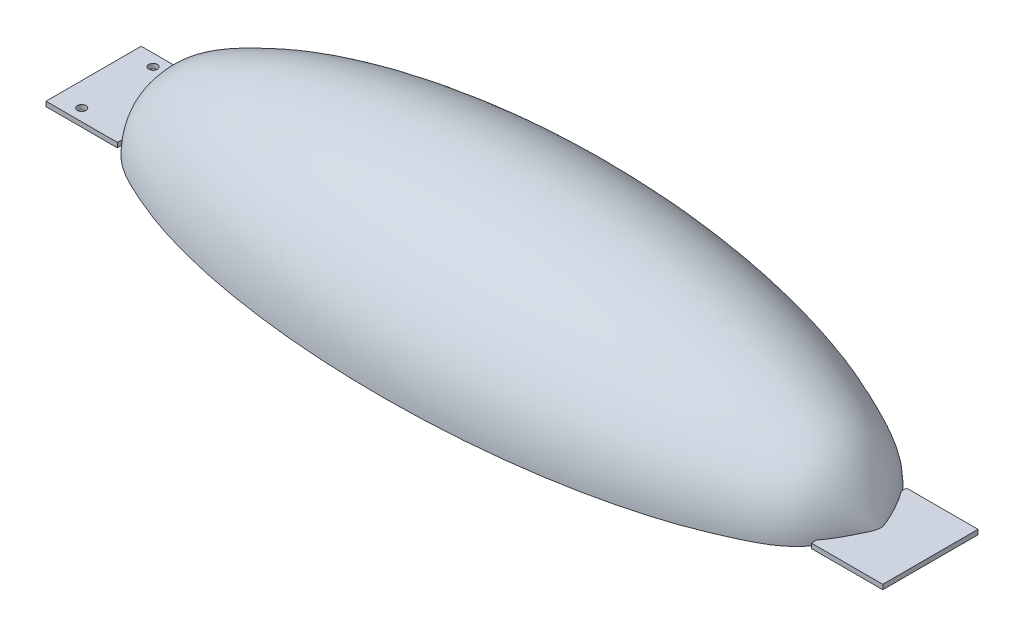
ISO-10303-21;
HEADER;
FILE_DESCRIPTION(('STEP AP214'),'2;1');
FILE_NAME('part.step','',(''),(''),'','','');
FILE_SCHEMA(('AUTOMOTIVE_DESIGN { 1 0 10303 214 1 1 1 1 }'));
ENDSEC;
DATA;
#1=APPLICATION_CONTEXT('core data for automotive mechanical design processes');
#2=APPLICATION_PROTOCOL_DEFINITION('international standard','automotive_design',2000,#1);
#3=PRODUCT_CONTEXT('',#1,'mechanical');
#4=PRODUCT('Part','Part','',(#3));
#5=PRODUCT_RELATED_PRODUCT_CATEGORY('part','',(#4));
#6=PRODUCT_DEFINITION_FORMATION('','',#4);
#7=PRODUCT_DEFINITION_CONTEXT('part definition',#1,'design');
#8=PRODUCT_DEFINITION('design','',#6,#7);
#9=PRODUCT_DEFINITION_SHAPE('','',#8);
#10=(LENGTH_UNIT() NAMED_UNIT(*) SI_UNIT(.MILLI.,.METRE.));
#11=(NAMED_UNIT(*) PLANE_ANGLE_UNIT() SI_UNIT($,.RADIAN.));
#12=(NAMED_UNIT(*) SI_UNIT($,.STERADIAN.) SOLID_ANGLE_UNIT());
#13=UNCERTAINTY_MEASURE_WITH_UNIT(LENGTH_MEASURE(1.E-05),#10,'distance_accuracy_value','');
#14=(GEOMETRIC_REPRESENTATION_CONTEXT(3) GLOBAL_UNCERTAINTY_ASSIGNED_CONTEXT((#13)) GLOBAL_UNIT_ASSIGNED_CONTEXT((#10,
#11,#12)) REPRESENTATION_CONTEXT('',''));
#15=CARTESIAN_POINT('',(0.,0.,0.));
#16=DIRECTION('',(0.,0.,1.));
#17=DIRECTION('',(1.,0.,0.));
#18=AXIS2_PLACEMENT_3D('',#15,#16,#17);
#19=CARTESIAN_POINT('',(0.,0.,0.));
#20=CARTESIAN_POINT('',(-4.24918863823681,8.93994620161365,0.));
#21=CARTESIAN_POINT('',(-11.1739289632086,23.5090348526368,0.));
#22=CARTESIAN_POINT('',(-30.8101621592941,33.0469746867475,0.));
#23=CARTESIAN_POINT('',(-46.4415498782957,39.4769067402592,0.));
#24=CARTESIAN_POINT('',(-62.1775393076959,44.1339298862083,0.));
#25=CARTESIAN_POINT('',(-77.7885811071484,47.7570774206576,0.));
#26=CARTESIAN_POINT('',(-93.3968557858967,50.5181034476359,0.));
#27=CARTESIAN_POINT('',(-108.989945516036,52.5682722732172,0.));
#28=CARTESIAN_POINT('',(-124.579052843171,53.9844773462628,0.));
#29=CARTESIAN_POINT('',(-140.165074085182,54.8168656468974,0.));
#30=CARTESIAN_POINT('',(-155.75,55.0915085626568,0.));
#31=CARTESIAN_POINT('',(-171.334925914818,54.8168656468974,0.));
#32=CARTESIAN_POINT('',(-186.920947156829,53.9844773462628,0.));
#33=CARTESIAN_POINT('',(-202.510054483964,52.5682722732172,0.));
#34=CARTESIAN_POINT('',(-218.103144214103,50.5181034476359,0.));
#35=CARTESIAN_POINT('',(-233.711418892852,47.7570774206576,0.));
#36=CARTESIAN_POINT('',(-249.322460692304,44.1339298862083,0.));
#37=CARTESIAN_POINT('',(-265.058450121704,39.4769067402592,0.));
#38=CARTESIAN_POINT('',(-280.689837840706,33.0469746867476,0.));
#39=CARTESIAN_POINT('',(-300.326071036791,23.5090348526368,0.));
#40=CARTESIAN_POINT('',(-307.250811361763,8.93994620161365,0.));
#41=CARTESIAN_POINT('',(-311.5,0.,0.));
#42=B_SPLINE_CURVE_WITH_KNOTS('',3,(#19,#20,#21,#22,#23,#24,#25,#26,#27,#28,#29,#30,#31,#32,#33,
#34,#35,#36,#37,#38,#39,#40,#41),.UNSPECIFIED.,.F.,.F.,(4,1,1,1,1,1,1,1,1,1,1,1,1,1,1,1,1,1,1,1,
4),(0.,0.0821539230820725,0.133883108624973,0.182138728200726,0.228907224084584,
0.274864284857434,0.32032674165642,0.365472529622241,0.410415352889982,0.455236348864807,0.5,
0.544763651135193,0.589584647110018,0.634527470377759,0.67967325834358,0.725135715142566,
0.771092775915416,0.817861271799274,0.866116891375027,0.917846076917928,1.),.UNSPECIFIED.);
#43=CARTESIAN_POINT('',(10.,0.,0.));
#44=DIRECTION('',(1.,0.,0.));
#45=AXIS1_PLACEMENT('',#43,#44);
#46=SURFACE_OF_REVOLUTION('',#42,#45);
#47=CARTESIAN_POINT('',(0.,0.,0.));
#48=CARTESIAN_POINT('',(-4.24918863823681,0.,-8.93994620161365));
#49=CARTESIAN_POINT('',(-11.1739289632086,0.,-23.5090348526368));
#50=CARTESIAN_POINT('',(-30.8101621592941,0.,-33.0469746867475));
#51=CARTESIAN_POINT('',(-46.4415498782957,0.,-39.4769067402592));
#52=CARTESIAN_POINT('',(-62.1775393076959,0.,-44.1339298862083));
#53=CARTESIAN_POINT('',(-77.7885811071484,0.,-47.7570774206576));
#54=CARTESIAN_POINT('',(-93.3968557858967,0.,-50.5181034476359));
#55=CARTESIAN_POINT('',(-108.989945516036,0.,-52.5682722732172));
#56=CARTESIAN_POINT('',(-124.579052843171,0.,-53.9844773462628));
#57=CARTESIAN_POINT('',(-140.165074085182,0.,-54.8168656468974));
#58=CARTESIAN_POINT('',(-155.75,0.,-55.0915085626568));
#59=CARTESIAN_POINT('',(-171.334925914818,0.,-54.8168656468974));
#60=CARTESIAN_POINT('',(-186.920947156829,0.,-53.9844773462628));
#61=CARTESIAN_POINT('',(-202.510054483964,0.,-52.5682722732172));
#62=CARTESIAN_POINT('',(-218.103144214103,0.,-50.5181034476359));
#63=CARTESIAN_POINT('',(-233.711418892852,0.,-47.7570774206576));
#64=CARTESIAN_POINT('',(-249.322460692304,0.,-44.1339298862083));
#65=CARTESIAN_POINT('',(-265.058450121704,0.,-39.4769067402592));
#66=CARTESIAN_POINT('',(-280.689837840706,0.,-33.0469746867476));
#67=CARTESIAN_POINT('',(-300.326071036791,0.,-23.5090348526368));
#68=CARTESIAN_POINT('',(-307.250811361763,0.,-8.93994620161365));
#69=CARTESIAN_POINT('',(-311.5,0.,0.));
#70=B_SPLINE_CURVE_WITH_KNOTS('',3,(#47,#48,#49,#50,#51,#52,#53,#54,#55,#56,#57,#58,#59,#60,#61,
#62,#63,#64,#65,#66,#67,#68,#69),.UNSPECIFIED.,.F.,.F.,(4,1,1,1,1,1,1,1,1,1,1,1,1,1,1,1,1,1,1,1,
4),(0.,0.0821539230820725,0.133883108624973,0.182138728200726,0.228907224084584,
0.274864284857434,0.32032674165642,0.365472529622241,0.410415352889982,0.455236348864807,0.5,
0.544763651135193,0.589584647110018,0.634527470377759,0.67967325834358,0.725135715142566,
0.771092775915416,0.817861271799274,0.866116891375027,0.917846076917928,1.),.UNSPECIFIED.);
#71=CARTESIAN_POINT('',(-9.99999999997378,0.,-17.9403331499537));
#72=VERTEX_POINT('',#71);
#73=CARTESIAN_POINT('',(-301.500000000026,0.,-17.9403331499536));
#74=VERTEX_POINT('',#73);
#75=EDGE_CURVE('E206',#72,#74,#70,.T.);
#76=ORIENTED_EDGE('',*,*,#75,.T.);
#77=CARTESIAN_POINT('',(-301.5,0.,0.));
#78=DIRECTION('',(1.,0.,0.));
#79=DIRECTION('',(0.,0.,-1.));
#80=AXIS2_PLACEMENT_3D('',#77,#78,#79);
#81=CIRCLE('',#80,17.9403331499886);
#82=CARTESIAN_POINT('',(-301.5,2.,-17.8285039622672));
#83=VERTEX_POINT('',#82);
#84=EDGE_CURVE('E60',#74,#83,#81,.T.);
#85=ORIENTED_EDGE('',*,*,#84,.T.);
#86=CARTESIAN_POINT('',(-301.5,2.,-17.8285039622672));
#87=CARTESIAN_POINT('',(-301.798385332736,2.,-17.4295350856485));
#88=CARTESIAN_POINT('',(-302.090418483702,2.,-17.0258686921947));
#89=CARTESIAN_POINT('',(-302.662581837847,2.,-16.2102870448934));
#90=CARTESIAN_POINT('',(-302.942714169668,2.,-15.7983732857687));
#91=CARTESIAN_POINT('',(-303.492148533474,2.,-14.9670498550689));
#92=CARTESIAN_POINT('',(-303.761443971733,2.,-14.5476358375596));
#93=CARTESIAN_POINT('',(-304.289917358303,2.,-13.7024607432487));
#94=CARTESIAN_POINT('',(-304.549094802259,2.,-13.2766993515061));
#95=CARTESIAN_POINT('',(-305.0228229421,2.,-12.4791879330893));
#96=CARTESIAN_POINT('',(-305.238572665176,2.,-12.1081483019192));
#97=CARTESIAN_POINT('',(-305.663716030617,2.,-11.3624417650524));
#98=CARTESIAN_POINT('',(-305.873109591799,2.,-10.9877748131075));
#99=CARTESIAN_POINT('',(-306.286017382106,2.,-10.2351988708037));
#100=CARTESIAN_POINT('',(-306.489531370273,2.,-9.85728974839567));
#101=CARTESIAN_POINT('',(-306.890674787227,2.,-9.09930369312994));
#102=CARTESIAN_POINT('',(-307.088314889927,2.,-8.71923240512094));
#103=CARTESIAN_POINT('',(-307.478369254304,2.,-7.956437733251));
#104=CARTESIAN_POINT('',(-307.670783714485,2.,-7.57371445082527));
#105=CARTESIAN_POINT('',(-308.050404685901,2.,-6.80573101197081));
#106=CARTESIAN_POINT('',(-308.237611638116,2.,-6.42047107378836));
#107=CARTESIAN_POINT('',(-308.523681548517,2.,-5.82055931805917));
#108=CARTESIAN_POINT('',(-308.624525502049,2.,-5.60685089201156));
#109=CARTESIAN_POINT('',(-308.82426617244,2.,-5.17851343016231));
#110=CARTESIAN_POINT('',(-308.923162804671,2.,-4.96388435484136));
#111=CARTESIAN_POINT('',(-309.118658695127,2.,-4.533530634792));
#112=CARTESIAN_POINT('',(-309.215257511663,2.,-4.31780578895065));
#113=CARTESIAN_POINT('',(-309.406263697136,2.,-3.88328182043135));
#114=CARTESIAN_POINT('',(-309.500646726722,2.,-3.66447197879891));
#115=CARTESIAN_POINT('',(-309.685227761516,2.,-3.2251102017482));
#116=CARTESIAN_POINT('',(-309.77542633229,2.,-3.00455850649991));
#117=CARTESIAN_POINT('',(-309.905904557443,2.,-2.67184847180237));
#118=CARTESIAN_POINT('',(-309.948592383859,2.,-2.56063595443513));
#119=CARTESIAN_POINT('',(-310.031897436082,2.,-2.33743583075606));
#120=CARTESIAN_POINT('',(-310.072514703262,1.99999999999999,-2.22544823998208));
#121=CARTESIAN_POINT('',(-310.142894043181,1.99999999999999,-2.02390657039052));
#122=CARTESIAN_POINT('',(-310.173157542516,2.,-1.93452810665464));
#123=CARTESIAN_POINT('',(-310.231574763773,2.,-1.7550845459364));
#124=CARTESIAN_POINT('',(-310.259728578326,2.,-1.66501947929245));
#125=CARTESIAN_POINT('',(-310.313406282145,2.,-1.48406200011833));
#126=CARTESIAN_POINT('',(-310.338929064299,2.,-1.39316925667705));
#127=CARTESIAN_POINT('',(-310.386661827853,2.,-1.21050802507386));
#128=CARTESIAN_POINT('',(-310.408871785081,2.,-1.11873953052752));
#129=CARTESIAN_POINT('',(-310.448818750565,2.,-0.935945032232938));
#130=CARTESIAN_POINT('',(-310.466628792128,2.,-0.844935199446854));
#131=CARTESIAN_POINT('',(-310.49745573452,2.,-0.66211096722644));
#132=CARTESIAN_POINT('',(-310.510473539618,2.,-0.570296722931097));
#133=CARTESIAN_POINT('',(-310.53093735041,2.,-0.386188216721894));
#134=CARTESIAN_POINT('',(-310.538392416282,2.,-0.29389498297272));
#135=CARTESIAN_POINT('',(-310.547246464625,2.,-0.109016731005704));
#136=CARTESIAN_POINT('',(-310.548645774245,1.99999999999999,-0.0164317288203716));
#137=CARTESIAN_POINT('',(-310.545268579027,1.99999999999999,0.169449788580773));
#138=CARTESIAN_POINT('',(-310.540436851603,2.,0.262745280351541));
#139=CARTESIAN_POINT('',(-310.524859902436,2.,0.448837651237106));
#140=CARTESIAN_POINT('',(-310.51411418739,2.,0.541634488105531));
#141=CARTESIAN_POINT('',(-310.48738341697,2.,0.726632325700262));
#142=CARTESIAN_POINT('',(-310.471388642186,2.,0.818831895065267));
#143=CARTESIAN_POINT('',(-310.435006588977,2.,1.00234975867473));
#144=CARTESIAN_POINT('',(-310.414619170081,2.,1.09366802463881));
#145=CARTESIAN_POINT('',(-310.369830479784,2.,1.27722300173701));
#146=CARTESIAN_POINT('',(-310.345357683076,2.,1.36944206087781));
#147=CARTESIAN_POINT('',(-310.293441396797,2.,1.55304571979899));
#148=CARTESIAN_POINT('',(-310.26599750832,2.,1.64443020573733));
#149=CARTESIAN_POINT('',(-310.208738610374,2.,1.82648817593622));
#150=CARTESIAN_POINT('',(-310.178922668356,2.,1.91716136501357));
#151=CARTESIAN_POINT('',(-310.11740227742,2.,2.0978664028638));
#152=CARTESIAN_POINT('',(-310.085697734268,2.00000000000001,2.18789821938333));
#153=CARTESIAN_POINT('',(-310.001376132818,2.00000000000001,2.42105394585351));
#154=CARTESIAN_POINT('',(-309.9475844841,2.,2.56375230507801));
#155=CARTESIAN_POINT('',(-309.837229518652,2.,2.84801715180607));
#156=CARTESIAN_POINT('',(-309.780667000173,2.,2.98958395178481));
#157=CARTESIAN_POINT('',(-309.665417285159,2.,3.27193028150079));
#158=CARTESIAN_POINT('',(-309.606729041046,2.,3.41270938248991));
#159=CARTESIAN_POINT('',(-309.487711824693,2.,3.69358197451164));
#160=CARTESIAN_POINT('',(-309.427382736107,2.,3.83367541609184));
#161=CARTESIAN_POINT('',(-309.244354700659,2.,4.25328298044437));
#162=CARTESIAN_POINT('',(-309.119691298414,2.,4.5319400534633));
#163=CARTESIAN_POINT('',(-308.866555206236,2.,5.08764999599921));
#164=CARTESIAN_POINT('',(-308.738080948668,2.,5.36470214769187));
#165=CARTESIAN_POINT('',(-308.478046533354,2.,5.91734820689769));
#166=CARTESIAN_POINT('',(-308.346486424478,2.,6.19294213742008));
#167=CARTESIAN_POINT('',(-308.081927840105,2.,6.7400511402684));
#168=CARTESIAN_POINT('',(-307.948956785647,2.,7.0115794833639));
#169=CARTESIAN_POINT('',(-307.68049270053,2.,7.55320496567144));
#170=CARTESIAN_POINT('',(-307.545001061663,2.,7.82330279477469));
#171=CARTESIAN_POINT('',(-307.271478584309,2.,8.36209229537632));
#172=CARTESIAN_POINT('',(-307.133448640771,2.,8.63078442114613));
#173=CARTESIAN_POINT('',(-306.854760760704,2.,9.16675059799383));
#174=CARTESIAN_POINT('',(-306.714103228828,2.,9.43402485941624));
#175=CARTESIAN_POINT('',(-306.430023611586,2.,9.96711878789447));
#176=CARTESIAN_POINT('',(-306.28660138197,2.,10.2329383781176));
#177=CARTESIAN_POINT('',(-306.003290596992,2.,10.751233342924));
#178=CARTESIAN_POINT('',(-305.86352769713,2.,11.0037773821568));
#179=CARTESIAN_POINT('',(-305.581194057464,2.,11.5073511900772));
#180=CARTESIAN_POINT('',(-305.438622820377,2.,11.758380680109));
#181=CARTESIAN_POINT('',(-305.150534773367,2.,12.2587720642632));
#182=CARTESIAN_POINT('',(-305.005017722537,2.,12.5081338197631));
#183=CARTESIAN_POINT('',(-304.710889203485,2.,13.0050299899311));
#184=CARTESIAN_POINT('',(-304.562277704838,2.,13.2525643865997));
#185=CARTESIAN_POINT('',(-304.26180235499,2.,13.7456407226415));
#186=CARTESIAN_POINT('',(-304.10993861613,2.,13.9911827304344));
#187=CARTESIAN_POINT('',(-303.801982532753,2.,14.4813948133047));
#188=CARTESIAN_POINT('',(-303.645872226265,2.,14.7260536115262));
#189=CARTESIAN_POINT('',(-303.33002366542,2.,15.2130071185934));
#190=CARTESIAN_POINT('',(-303.170285541651,2.,15.4553019120864));
#191=CARTESIAN_POINT('',(-302.847002547725,2.,15.9373430236379));
#192=CARTESIAN_POINT('',(-302.683457643566,2.,16.1770893189053));
#193=CARTESIAN_POINT('',(-302.352376500508,2.,16.65384629583));
#194=CARTESIAN_POINT('',(-302.1848398833,2.,16.890856715014));
#195=CARTESIAN_POINT('',(-301.845587362945,2.,17.3619479606889));
#196=CARTESIAN_POINT('',(-301.673870521444,2.,17.5960281112157));
#197=CARTESIAN_POINT('',(-301.5,2.,17.8285039622673));
#198=B_SPLINE_CURVE_WITH_KNOTS('',3,(#86,#87,#88,#89,#90,#91,#92,#93,#94,#95,#96,#97,#98,#99,
#100,#101,#102,#103,#104,#105,#106,#107,#108,#109,#110,#111,#112,#113,#114,#115,#116,#117,#118,
#119,#120,#121,#122,#123,#124,#125,#126,#127,#128,#129,#130,#131,#132,#133,#134,#135,#136,#137,
#138,#139,#140,#141,#142,#143,#144,#145,#146,#147,#148,#149,#150,#151,#152,#153,#154,#155,#156,
#157,#158,#159,#160,#161,#162,#163,#164,#165,#166,#167,#168,#169,#170,#171,#172,#173,#174,#175,
#176,#177,#178,#179,#180,#181,#182,#183,#184,#185,#186,#187,#188,#189,#190,#191,#192,#193,#194,
#195,#196,#197),.UNSPECIFIED.,.F.,.F.,(4,2,2,2,2,2,2,2,2,2,2,2,2,2,2,2,2,2,2,2,2,2,2,2,2,2,2,2,
2,2,2,2,2,2,2,2,2,2,2,2,2,2,2,2,2,2,2,2,2,2,2,2,2,2,2,4),(0.,1.4944957604627,2.98872307267503,
4.4838462118479,5.97904378389944,7.26659866668967,8.55416998740199,9.84179400047603,
11.1269140033334,12.4119851204614,13.6969470822014,14.4058590617225,15.1148017823924,
15.8238796936594,16.5387483935498,17.2535201894904,17.6108769264148,17.968226520063,
18.2512954463789,18.5343519366087,18.8175270520165,19.1007042334192,19.37880608905,
19.6568554414645,19.9344509332955,20.2120314285093,20.4920889705404,20.7721698765352,
21.052772347825,21.3333837937019,21.6195551716974,21.9057650194182,22.1920879489945,
22.4784251769538,22.9358812345857,23.3932062715982,23.8507598339029,24.3083459242919,
25.2241163925886,26.1402689446124,27.0564069973176,27.9634104022649,28.8699270367992,
29.7761299601236,30.6821944589865,31.5883063611355,32.454205236072,33.3202588422689,
34.1863835619288,35.0525168015039,35.9186201705945,36.7892533513787,37.6598552424177,
38.5304649127421,39.4011574244499,40.2720472203626),.UNSPECIFIED.);
#199=CARTESIAN_POINT('',(-301.5,2.,17.8285039622673));
#200=VERTEX_POINT('',#199);
#201=EDGE_CURVE('E11',#83,#200,#198,.T.);
#202=ORIENTED_EDGE('',*,*,#201,.T.);
#203=CARTESIAN_POINT('',(-301.5,0.,17.9403331499536));
#204=VERTEX_POINT('',#203);
#205=EDGE_CURVE('E194',#200,#204,#81,.T.);
#206=ORIENTED_EDGE('',*,*,#205,.T.);
#207=CARTESIAN_POINT('',(0.,0.,0.));
#208=CARTESIAN_POINT('',(-4.24918863823681,0.,8.93994620161365));
#209=CARTESIAN_POINT('',(-11.1739289632086,0.,23.5090348526368));
#210=CARTESIAN_POINT('',(-30.8101621592941,0.,33.0469746867475));
#211=CARTESIAN_POINT('',(-46.4415498782957,0.,39.4769067402592));
#212=CARTESIAN_POINT('',(-62.1775393076959,0.,44.1339298862083));
#213=CARTESIAN_POINT('',(-77.7885811071484,0.,47.7570774206576));
#214=CARTESIAN_POINT('',(-93.3968557858967,0.,50.5181034476359));
#215=CARTESIAN_POINT('',(-108.989945516036,0.,52.5682722732172));
#216=CARTESIAN_POINT('',(-124.579052843171,0.,53.9844773462628));
#217=CARTESIAN_POINT('',(-140.165074085182,0.,54.8168656468974));
#218=CARTESIAN_POINT('',(-155.75,0.,55.0915085626568));
#219=CARTESIAN_POINT('',(-171.334925914818,0.,54.8168656468974));
#220=CARTESIAN_POINT('',(-186.920947156829,0.,53.9844773462628));
#221=CARTESIAN_POINT('',(-202.510054483964,0.,52.5682722732172));
#222=CARTESIAN_POINT('',(-218.103144214103,0.,50.5181034476359));
#223=CARTESIAN_POINT('',(-233.711418892852,0.,47.7570774206576));
#224=CARTESIAN_POINT('',(-249.322460692304,0.,44.1339298862083));
#225=CARTESIAN_POINT('',(-265.058450121704,0.,39.4769067402592));
#226=CARTESIAN_POINT('',(-280.689837840706,0.,33.0469746867476));
#227=CARTESIAN_POINT('',(-300.326071036791,0.,23.5090348526368));
#228=CARTESIAN_POINT('',(-307.250811361763,0.,8.93994620161365));
#229=CARTESIAN_POINT('',(-311.5,0.,0.));
#230=B_SPLINE_CURVE_WITH_KNOTS('',3,(#207,#208,#209,#210,#211,#212,#213,#214,#215,#216,#217,
#218,#219,#220,#221,#222,#223,#224,#225,#226,#227,#228,#229),.UNSPECIFIED.,.F.,.F.,(4,1,1,1,1,1,
1,1,1,1,1,1,1,1,1,1,1,1,1,1,4),(0.,0.0821539230820725,0.133883108624973,0.182138728200726,
0.228907224084584,0.274864284857434,0.32032674165642,0.365472529622241,0.410415352889982,
0.455236348864807,0.5,0.544763651135193,0.589584647110018,0.634527470377759,0.67967325834358,
0.725135715142566,0.771092775915416,0.817861271799274,0.866116891375027,0.917846076917928,1.),.UNSPECIFIED.);
#231=CARTESIAN_POINT('',(-9.99999999997378,0.,17.9403331499537));
#232=VERTEX_POINT('',#231);
#233=EDGE_CURVE('E199',#204,#232,#230,.F.);
#234=ORIENTED_EDGE('',*,*,#233,.T.);
#235=CARTESIAN_POINT('',(-10.,0.,0.));
#236=DIRECTION('',(1.,0.,0.));
#237=DIRECTION('',(0.,0.,-1.));
#238=AXIS2_PLACEMENT_3D('',#235,#236,#237);
#239=CIRCLE('',#238,17.9403331499885);
#240=CARTESIAN_POINT('',(-10.,2.,17.8285039622672));
#241=VERTEX_POINT('',#240);
#242=EDGE_CURVE('E156',#232,#241,#239,.F.);
#243=ORIENTED_EDGE('',*,*,#242,.T.);
#244=CARTESIAN_POINT('',(-10.,2.,17.8285039622672));
#245=CARTESIAN_POINT('',(-9.70161466726378,2.,17.4295350856484));
#246=CARTESIAN_POINT('',(-9.40958151629842,2.,17.0258686921946));
#247=CARTESIAN_POINT('',(-8.8374181621527,2.,16.2102870448933));
#248=CARTESIAN_POINT('',(-8.55728583033218,2.,15.7983732857686));
#249=CARTESIAN_POINT('',(-8.00785146652613,2.,14.9670498550688));
#250=CARTESIAN_POINT('',(-7.73855602826661,2.,14.5476358375595));
#251=CARTESIAN_POINT('',(-7.2100826416968,2.,13.7024607432487));
#252=CARTESIAN_POINT('',(-6.95090519774082,2.,13.276699351506));
#253=CARTESIAN_POINT('',(-6.47717705789978,2.,12.4791879330892));
#254=CARTESIAN_POINT('',(-6.26142733482386,2.,12.1081483019192));
#255=CARTESIAN_POINT('',(-5.83628396938335,2.,11.3624417650524));
#256=CARTESIAN_POINT('',(-5.62689040820057,2.,10.9877748131075));
#257=CARTESIAN_POINT('',(-5.21398261789449,2.,10.2351988708037));
#258=CARTESIAN_POINT('',(-5.0104686297267,2.,9.85728974839563));
#259=CARTESIAN_POINT('',(-4.60932521277301,2.,9.09930369312992));
#260=CARTESIAN_POINT('',(-4.41168511007286,2.,8.71923240512094));
#261=CARTESIAN_POINT('',(-4.02163074569599,2.,7.95643773325099));
#262=CARTESIAN_POINT('',(-3.82921628551523,2.,7.57371445082523));
#263=CARTESIAN_POINT('',(-3.44959531409942,2.,6.80573101197077));
#264=CARTESIAN_POINT('',(-3.2623883618836,2.,6.42047107378835));
#265=CARTESIAN_POINT('',(-2.97631845148283,2.,5.82055931805917));
#266=CARTESIAN_POINT('',(-2.87547449795144,2.,5.60685089201155));
#267=CARTESIAN_POINT('',(-2.67573382756008,2.,5.17851343016229));
#268=CARTESIAN_POINT('',(-2.5768371953294,2.,4.96388435484133));
#269=CARTESIAN_POINT('',(-2.3813413048726,2.,4.53353063479199));
#270=CARTESIAN_POINT('',(-2.28474248833648,2.,4.31780578895067));
#271=CARTESIAN_POINT('',(-2.09373630286382,2.,3.88328182043138));
#272=CARTESIAN_POINT('',(-1.99935327327763,2.,3.66447197879891));
#273=CARTESIAN_POINT('',(-1.81477223848392,2.,3.22511020174818));
#274=CARTESIAN_POINT('',(-1.72457366771018,2.,3.00455850649992));
#275=CARTESIAN_POINT('',(-1.59409544255685,2.,2.67184847180239));
#276=CARTESIAN_POINT('',(-1.55140761614104,2.,2.56063595443515));
#277=CARTESIAN_POINT('',(-1.46810256391773,2.,2.33743583075607));
#278=CARTESIAN_POINT('',(-1.42748529673762,2.,2.22544823998208));
#279=CARTESIAN_POINT('',(-1.35710595681897,2.,2.02390657039052));
#280=CARTESIAN_POINT('',(-1.3268424574844,2.,1.93452810665465));
#281=CARTESIAN_POINT('',(-1.26842523622709,2.,1.75508454593641));
#282=CARTESIAN_POINT('',(-1.24027142167378,2.,1.66501947929245));
#283=CARTESIAN_POINT('',(-1.1865937178549,2.,1.48406200011834));
#284=CARTESIAN_POINT('',(-1.1610709357005,2.,1.39316925667706));
#285=CARTESIAN_POINT('',(-1.11333817214686,2.,1.21050802507388));
#286=CARTESIAN_POINT('',(-1.09112821491857,2.,1.11873953052753));
#287=CARTESIAN_POINT('',(-1.05118124943536,2.,0.935945032232941));
#288=CARTESIAN_POINT('',(-1.03337120787193,2.,0.844935199446858));
#289=CARTESIAN_POINT('',(-1.00254426547974,2.,0.662110967226449));
#290=CARTESIAN_POINT('',(-0.989526460382394,2.,0.570296722931111));
#291=CARTESIAN_POINT('',(-0.969062649589545,2.,0.386188216721913));
#292=CARTESIAN_POINT('',(-0.961607583718123,2.,0.29389498297274));
#293=CARTESIAN_POINT('',(-0.952753535374539,2.,0.109016731005723));
#294=CARTESIAN_POINT('',(-0.951354225754685,2.,0.0164317288203908));
#295=CARTESIAN_POINT('',(-0.954731420973399,2.,-0.16944978858075));
#296=CARTESIAN_POINT('',(-0.959563148397001,2.,-0.262745280351514));
#297=CARTESIAN_POINT('',(-0.975140097563722,2.,-0.448837651237079));
#298=CARTESIAN_POINT('',(-0.985885812609925,2.,-0.541634488105508));
#299=CARTESIAN_POINT('',(-1.01261658302993,2.,-0.726632325700233));
#300=CARTESIAN_POINT('',(-1.02861135781403,2.,-0.818831895065229));
#301=CARTESIAN_POINT('',(-1.0649934110232,2.,-1.00234975867469));
#302=CARTESIAN_POINT('',(-1.08538082991859,2.,-1.09366802463878));
#303=CARTESIAN_POINT('',(-1.13016952021632,2.,-1.27722300173697));
#304=CARTESIAN_POINT('',(-1.15464231692419,2.,-1.36944206087777));
#305=CARTESIAN_POINT('',(-1.20655860320335,2.,-1.55304571979894));
#306=CARTESIAN_POINT('',(-1.2340024916796,2.,-1.64443020573729));
#307=CARTESIAN_POINT('',(-1.29126138962547,2.,-1.82648817593618));
#308=CARTESIAN_POINT('',(-1.32107733164373,2.,-1.91716136501353));
#309=CARTESIAN_POINT('',(-1.38259772258018,2.,-2.09786640286374));
#310=CARTESIAN_POINT('',(-1.4143022657322,2.,-2.18789821938327));
#311=CARTESIAN_POINT('',(-1.49862386718153,2.,-2.42105394585346));
#312=CARTESIAN_POINT('',(-1.55241551590032,2.,-2.56375230507798));
#313=CARTESIAN_POINT('',(-1.66277048134804,2.,-2.84801715180604));
#314=CARTESIAN_POINT('',(-1.71933299982712,2.,-2.98958395178478));
#315=CARTESIAN_POINT('',(-1.83458271484101,2.,-3.27193028150077));
#316=CARTESIAN_POINT('',(-1.89327095895366,2.,-3.41270938248989));
#317=CARTESIAN_POINT('',(-2.01228817530712,2.,-3.69358197451163));
#318=CARTESIAN_POINT('',(-2.07261726389284,2.,-3.83367541609183));
#319=CARTESIAN_POINT('',(-2.25564529934118,2.,-4.25328298044435));
#320=CARTESIAN_POINT('',(-2.38030870158599,2.,-4.53194005346329));
#321=CARTESIAN_POINT('',(-2.63344479376381,2.,-5.0876499959992));
#322=CARTESIAN_POINT('',(-2.76191905133152,2.,-5.36470214769185));
#323=CARTESIAN_POINT('',(-3.02195346664583,2.,-5.91734820689766));
#324=CARTESIAN_POINT('',(-3.15351357552184,2.,-6.19294213742004));
#325=CARTESIAN_POINT('',(-3.41807215989515,2.,-6.74005114026834));
#326=CARTESIAN_POINT('',(-3.55104321435274,2.,-7.01157948336384));
#327=CARTESIAN_POINT('',(-3.81950729947029,2.,-7.55320496567138));
#328=CARTESIAN_POINT('',(-3.95499893833752,2.,-7.82330279477464));
#329=CARTESIAN_POINT('',(-4.2285214156905,2.,-8.36209229537628));
#330=CARTESIAN_POINT('',(-4.3665513592287,2.,-8.63078442114608));
#331=CARTESIAN_POINT('',(-4.64523923929559,2.,-9.16675059799378));
#332=CARTESIAN_POINT('',(-4.78589677117196,2.,-9.43402485941622));
#333=CARTESIAN_POINT('',(-5.06997638841406,2.,-9.96711878789444));
#334=CARTESIAN_POINT('',(-5.21339861803009,2.,-10.2329383781175));
#335=CARTESIAN_POINT('',(-5.49670940300811,2.,-10.751233342924));
#336=CARTESIAN_POINT('',(-5.6364723028702,2.,-11.0037773821567));
#337=CARTESIAN_POINT('',(-5.91880594253625,2.,-11.5073511900771));
#338=CARTESIAN_POINT('',(-6.06137717962257,2.,-11.758380680109));
#339=CARTESIAN_POINT('',(-6.3494652266333,2.,-12.2587720642631));
#340=CARTESIAN_POINT('',(-6.49498227746355,2.,-12.5081338197631));
#341=CARTESIAN_POINT('',(-6.78911079651515,2.,-13.005029989931));
#342=CARTESIAN_POINT('',(-6.93772229516166,2.,-13.2525643865997));
#343=CARTESIAN_POINT('',(-7.2381976450098,2.,-13.7456407226414));
#344=CARTESIAN_POINT('',(-7.39006138387024,2.,-13.9911827304344));
#345=CARTESIAN_POINT('',(-7.69801746724719,2.,-14.4813948133046));
#346=CARTESIAN_POINT('',(-7.85412777373523,2.,-14.7260536115261));
#347=CARTESIAN_POINT('',(-8.16997633457966,2.,-15.2130071185933));
#348=CARTESIAN_POINT('',(-8.32971445834935,2.,-15.4553019120863));
#349=CARTESIAN_POINT('',(-8.6529974522752,2.,-15.9373430236379));
#350=CARTESIAN_POINT('',(-8.81654235643388,2.,-16.1770893189052));
#351=CARTESIAN_POINT('',(-9.14762349949246,2.,-16.6538462958299));
#352=CARTESIAN_POINT('',(-9.31516011670027,2.,-16.8908567150139));
#353=CARTESIAN_POINT('',(-9.65441263705469,2.,-17.3619479606889));
#354=CARTESIAN_POINT('',(-9.82612947855553,2.,-17.5960281112156));
#355=CARTESIAN_POINT('',(-10.,2.,-17.8285039622672));
#356=B_SPLINE_CURVE_WITH_KNOTS('',3,(#244,#245,#246,#247,#248,#249,#250,#251,#252,#253,#254,
#255,#256,#257,#258,#259,#260,#261,#262,#263,#264,#265,#266,#267,#268,#269,#270,#271,#272,#273,
#274,#275,#276,#277,#278,#279,#280,#281,#282,#283,#284,#285,#286,#287,#288,#289,#290,#291,#292,
#293,#294,#295,#296,#297,#298,#299,#300,#301,#302,#303,#304,#305,#306,#307,#308,#309,#310,#311,
#312,#313,#314,#315,#316,#317,#318,#319,#320,#321,#322,#323,#324,#325,#326,#327,#328,#329,#330,
#331,#332,#333,#334,#335,#336,#337,#338,#339,#340,#341,#342,#343,#344,#345,#346,#347,#348,#349,
#350,#351,#352,#353,#354,#355),.UNSPECIFIED.,.F.,.F.,(4,2,2,2,2,2,2,2,2,2,2,2,2,2,2,2,2,2,2,2,2,
2,2,2,2,2,2,2,2,2,2,2,2,2,2,2,2,2,2,2,2,2,2,2,2,2,2,2,2,2,2,2,2,2,2,4),(0.,1.49449576046272,
2.98872307267502,4.4838462118479,5.97904378389945,7.26659866668968,8.55416998740198,
9.84179400047601,11.1269140033333,12.4119851204614,13.6969470822013,14.4058590617225,
15.1148017823924,15.8238796936594,16.5387483935498,17.2535201894903,17.6108769264148,
17.968226520063,18.2512954463789,18.5343519366086,18.8175270520165,19.1007042334191,
19.37880608905,19.6568554414644,19.9344509332954,20.2120314285093,20.4920889705403,
20.7721698765351,21.0527723478249,21.3333837937018,21.6195551716973,21.9057650194181,
22.1920879489943,22.4784251769537,22.9358812345856,23.3932062715981,23.8507598339028,
24.3083459242918,25.2241163925885,26.1402689446123,27.0564069973175,27.9634104022648,
28.8699270367991,29.7761299601235,30.6821944589864,31.5883063611354,32.4542052360719,
33.3202588422688,34.1863835619287,35.0525168015038,35.9186201705944,36.7892533513785,
37.6598552424175,38.5304649127419,39.4011574244497,40.2720472203625),.UNSPECIFIED.);
#357=CARTESIAN_POINT('',(-10.,2.,-17.8285039622672));
#358=VERTEX_POINT('',#357);
#359=EDGE_CURVE('E49',#241,#358,#356,.T.);
#360=ORIENTED_EDGE('',*,*,#359,.T.);
#361=EDGE_CURVE('E154',#358,#72,#239,.F.);
#362=ORIENTED_EDGE('',*,*,#361,.T.);
#363=EDGE_LOOP('',(#76,#85,#202,#206,#234,#243,#360,#362));
#364=FACE_BOUND('',#363,.T.);
#365=ADVANCED_FACE('F39',(#364),#46,.F.);
#366=CARTESIAN_POINT('',(0.,0.,0.));
#367=DIRECTION('',(0.,-1.,0.));
#368=DIRECTION('',(0.,0.,-1.));
#369=AXIS2_PLACEMENT_3D('',#366,#367,#368);
#370=PLANE('',#369);
#371=CARTESIAN_POINT('',(-321.5,0.,15.));
#372=DIRECTION('',(0.,1.,0.));
#373=DIRECTION('',(0.,0.,1.));
#374=AXIS2_PLACEMENT_3D('',#371,#372,#373);
#375=CIRCLE('',#374,1.80000000000002);
#376=CARTESIAN_POINT('',(-321.5,0.,16.8));
#377=VERTEX_POINT('',#376);
#378=EDGE_CURVE('E250',#377,#377,#375,.T.);
#379=ORIENTED_EDGE('',*,*,#378,.T.);
#380=EDGE_LOOP('',(#379));
#381=FACE_BOUND('',#380,.T.);
#382=CARTESIAN_POINT('',(-321.5,0.,-15.));
#383=DIRECTION('',(0.,1.,0.));
#384=DIRECTION('',(0.,0.,1.));
#385=AXIS2_PLACEMENT_3D('',#382,#383,#384);
#386=CIRCLE('',#385,1.80000000000002);
#387=CARTESIAN_POINT('',(-321.5,0.,-13.2));
#388=VERTEX_POINT('',#387);
#389=EDGE_CURVE('E254',#388,#388,#386,.T.);
#390=ORIENTED_EDGE('',*,*,#389,.T.);
#391=EDGE_LOOP('',(#390));
#392=FACE_BOUND('',#391,.T.);
#393=ORIENTED_EDGE('',*,*,#75,.F.);
#394=DIRECTION('',(0.,0.,1.));
#395=VECTOR('',#394,1.);
#396=CARTESIAN_POINT('',(-10.,0.,20.));
#397=LINE('',#396,#395);
#398=CARTESIAN_POINT('',(-10.,0.,-20.));
#399=VERTEX_POINT('',#398);
#400=EDGE_CURVE('E183',#399,#72,#397,.T.);
#401=ORIENTED_EDGE('',*,*,#400,.F.);
#402=DIRECTION('',(-1.,0.,0.));
#403=VECTOR('',#402,1.);
#404=CARTESIAN_POINT('',(-10.,0.,-20.));
#405=LINE('',#404,#403);
#406=CARTESIAN_POINT('',(20.,0.,-20.));
#407=VERTEX_POINT('',#406);
#408=EDGE_CURVE('E175',#407,#399,#405,.T.);
#409=ORIENTED_EDGE('',*,*,#408,.F.);
#410=DIRECTION('',(0.,0.,-1.));
#411=VECTOR('',#410,1.);
#412=CARTESIAN_POINT('',(20.,0.,-20.));
#413=LINE('',#412,#411);
#414=CARTESIAN_POINT('',(20.,0.,20.));
#415=VERTEX_POINT('',#414);
#416=EDGE_CURVE('E177',#415,#407,#413,.T.);
#417=ORIENTED_EDGE('',*,*,#416,.F.);
#418=DIRECTION('',(1.,0.,0.));
#419=VECTOR('',#418,1.);
#420=CARTESIAN_POINT('',(20.,0.,20.));
#421=LINE('',#420,#419);
#422=CARTESIAN_POINT('',(-10.,0.,20.));
#423=VERTEX_POINT('',#422);
#424=EDGE_CURVE('E180',#423,#415,#421,.T.);
#425=ORIENTED_EDGE('',*,*,#424,.F.);
#426=EDGE_CURVE('E182',#232,#423,#397,.T.);
#427=ORIENTED_EDGE('',*,*,#426,.F.);
#428=ORIENTED_EDGE('',*,*,#233,.F.);
#429=DIRECTION('',(0.,0.,-1.));
#430=VECTOR('',#429,1.);
#431=CARTESIAN_POINT('',(-301.5,0.,-20.));
#432=LINE('',#431,#430);
#433=CARTESIAN_POINT('',(-301.5,0.,20.));
#434=VERTEX_POINT('',#433);
#435=EDGE_CURVE('E283',#434,#204,#432,.T.);
#436=ORIENTED_EDGE('',*,*,#435,.F.);
#437=DIRECTION('',(1.,0.,0.));
#438=VECTOR('',#437,1.);
#439=CARTESIAN_POINT('',(-301.5,0.,20.));
#440=LINE('',#439,#438);
#441=CARTESIAN_POINT('',(-331.5,0.,20.));
#442=VERTEX_POINT('',#441);
#443=EDGE_CURVE('E288',#442,#434,#440,.T.);
#444=ORIENTED_EDGE('',*,*,#443,.F.);
#445=DIRECTION('',(0.,0.,1.));
#446=VECTOR('',#445,1.);
#447=CARTESIAN_POINT('',(-331.5,0.,20.));
#448=LINE('',#447,#446);
#449=CARTESIAN_POINT('',(-331.5,0.,-20.));
#450=VERTEX_POINT('',#449);
#451=EDGE_CURVE('E153',#450,#442,#448,.T.);
#452=ORIENTED_EDGE('',*,*,#451,.F.);
#453=DIRECTION('',(-1.,0.,0.));
#454=VECTOR('',#453,1.);
#455=CARTESIAN_POINT('',(-331.5,0.,-20.));
#456=LINE('',#455,#454);
#457=CARTESIAN_POINT('',(-301.5,0.,-20.));
#458=VERTEX_POINT('',#457);
#459=EDGE_CURVE('E149',#458,#450,#456,.T.);
#460=ORIENTED_EDGE('',*,*,#459,.F.);
#461=EDGE_CURVE('E260',#74,#458,#432,.T.);
#462=ORIENTED_EDGE('',*,*,#461,.F.);
#463=EDGE_LOOP('',(#393,#401,#409,#417,#425,#427,#428,#436,#444,#452,#460,#462));
#464=FACE_BOUND('',#463,.T.);
#465=ADVANCED_FACE('F234',(#381,#392,#464),#370,.T.);
#466=CARTESIAN_POINT('',(-10.,2.,20.));
#467=DIRECTION('',(1.,0.,0.));
#468=DIRECTION('',(0.,0.,-1.));
#469=AXIS2_PLACEMENT_3D('',#466,#467,#468);
#470=PLANE('',#469);
#471=ORIENTED_EDGE('',*,*,#242,.F.);
#472=ORIENTED_EDGE('',*,*,#426,.T.);
#473=DIRECTION('',(0.,-1.,0.));
#474=VECTOR('',#473,1.);
#475=CARTESIAN_POINT('',(-10.,2.,20.));
#476=LINE('',#475,#474);
#477=CARTESIAN_POINT('',(-10.,2.,20.));
#478=VERTEX_POINT('',#477);
#479=EDGE_CURVE('E162',#478,#423,#476,.T.);
#480=ORIENTED_EDGE('',*,*,#479,.F.);
#481=DIRECTION('',(0.,0.,1.));
#482=VECTOR('',#481,1.);
#483=CARTESIAN_POINT('',(-10.,2.,20.));
#484=LINE('',#483,#482);
#485=EDGE_CURVE('E191',#241,#478,#484,.T.);
#486=ORIENTED_EDGE('',*,*,#485,.F.);
#487=EDGE_LOOP('',(#471,#472,#480,#486));
#488=FACE_BOUND('',#487,.T.);
#489=ADVANCED_FACE('F236',(#488),#470,.F.);
#490=ORIENTED_EDGE('',*,*,#361,.F.);
#491=CARTESIAN_POINT('',(-10.,2.,-20.));
#492=VERTEX_POINT('',#491);
#493=EDGE_CURVE('E178',#492,#358,#484,.T.);
#494=ORIENTED_EDGE('',*,*,#493,.F.);
#495=DIRECTION('',(0.,-1.,0.));
#496=VECTOR('',#495,1.);
#497=CARTESIAN_POINT('',(-10.,2.,-20.));
#498=LINE('',#497,#496);
#499=EDGE_CURVE('E171',#492,#399,#498,.T.);
#500=ORIENTED_EDGE('',*,*,#499,.T.);
#501=ORIENTED_EDGE('',*,*,#400,.T.);
#502=EDGE_LOOP('',(#490,#494,#500,#501));
#503=FACE_BOUND('',#502,.T.);
#504=ADVANCED_FACE('F243',(#503),#470,.F.);
#505=CARTESIAN_POINT('',(20.,2.,20.));
#506=DIRECTION('',(0.,0.,-1.));
#507=DIRECTION('',(-1.,0.,0.));
#508=AXIS2_PLACEMENT_3D('',#505,#506,#507);
#509=PLANE('',#508);
#510=ORIENTED_EDGE('',*,*,#424,.T.);
#511=DIRECTION('',(0.,-1.,0.));
#512=VECTOR('',#511,1.);
#513=CARTESIAN_POINT('',(20.,2.,20.));
#514=LINE('',#513,#512);
#515=CARTESIAN_POINT('',(20.,2.,20.));
#516=VERTEX_POINT('',#515);
#517=EDGE_CURVE('E165',#516,#415,#514,.T.);
#518=ORIENTED_EDGE('',*,*,#517,.F.);
#519=DIRECTION('',(1.,0.,0.));
#520=VECTOR('',#519,1.);
#521=CARTESIAN_POINT('',(20.,2.,20.));
#522=LINE('',#521,#520);
#523=EDGE_CURVE('E189',#478,#516,#522,.T.);
#524=ORIENTED_EDGE('',*,*,#523,.F.);
#525=ORIENTED_EDGE('',*,*,#479,.T.);
#526=EDGE_LOOP('',(#510,#518,#524,#525));
#527=FACE_BOUND('',#526,.T.);
#528=ADVANCED_FACE('F277',(#527),#509,.F.);
#529=CARTESIAN_POINT('',(20.,2.,-20.));
#530=DIRECTION('',(-1.,0.,0.));
#531=DIRECTION('',(0.,0.,1.));
#532=AXIS2_PLACEMENT_3D('',#529,#530,#531);
#533=PLANE('',#532);
#534=ORIENTED_EDGE('',*,*,#416,.T.);
#535=DIRECTION('',(0.,-1.,0.));
#536=VECTOR('',#535,1.);
#537=CARTESIAN_POINT('',(20.,2.,-20.));
#538=LINE('',#537,#536);
#539=CARTESIAN_POINT('',(20.,2.,-20.));
#540=VERTEX_POINT('',#539);
#541=EDGE_CURVE('E168',#540,#407,#538,.T.);
#542=ORIENTED_EDGE('',*,*,#541,.F.);
#543=DIRECTION('',(0.,0.,-1.));
#544=VECTOR('',#543,1.);
#545=CARTESIAN_POINT('',(20.,2.,-20.));
#546=LINE('',#545,#544);
#547=EDGE_CURVE('E187',#516,#540,#546,.T.);
#548=ORIENTED_EDGE('',*,*,#547,.F.);
#549=ORIENTED_EDGE('',*,*,#517,.T.);
#550=EDGE_LOOP('',(#534,#542,#548,#549));
#551=FACE_BOUND('',#550,.T.);
#552=ADVANCED_FACE('F272',(#551),#533,.F.);
#553=CARTESIAN_POINT('',(-10.,2.,-20.));
#554=DIRECTION('',(0.,0.,1.));
#555=DIRECTION('',(1.,0.,0.));
#556=AXIS2_PLACEMENT_3D('',#553,#554,#555);
#557=PLANE('',#556);
#558=ORIENTED_EDGE('',*,*,#408,.T.);
#559=ORIENTED_EDGE('',*,*,#499,.F.);
#560=DIRECTION('',(-1.,0.,0.));
#561=VECTOR('',#560,1.);
#562=CARTESIAN_POINT('',(-10.,2.,-20.));
#563=LINE('',#562,#561);
#564=EDGE_CURVE('E174',#540,#492,#563,.T.);
#565=ORIENTED_EDGE('',*,*,#564,.F.);
#566=ORIENTED_EDGE('',*,*,#541,.T.);
#567=EDGE_LOOP('',(#558,#559,#565,#566));
#568=FACE_BOUND('',#567,.T.);
#569=ADVANCED_FACE('F231',(#568),#557,.F.);
#570=CARTESIAN_POINT('',(0.,2.,0.));
#571=DIRECTION('',(0.,-1.,0.));
#572=DIRECTION('',(0.,0.,-1.));
#573=AXIS2_PLACEMENT_3D('',#570,#571,#572);
#574=PLANE('',#573);
#575=ORIENTED_EDGE('',*,*,#359,.F.);
#576=ORIENTED_EDGE('',*,*,#485,.T.);
#577=ORIENTED_EDGE('',*,*,#523,.T.);
#578=ORIENTED_EDGE('',*,*,#547,.T.);
#579=ORIENTED_EDGE('',*,*,#564,.T.);
#580=ORIENTED_EDGE('',*,*,#493,.T.);
#581=EDGE_LOOP('',(#575,#576,#577,#578,#579,#580));
#582=FACE_BOUND('',#581,.T.);
#583=ADVANCED_FACE('F226',(#582),#574,.F.);
#584=CARTESIAN_POINT('',(-301.5,2.,-20.));
#585=DIRECTION('',(-1.,0.,0.));
#586=DIRECTION('',(0.,0.,1.));
#587=AXIS2_PLACEMENT_3D('',#584,#585,#586);
#588=PLANE('',#587);
#589=ORIENTED_EDGE('',*,*,#84,.F.);
#590=ORIENTED_EDGE('',*,*,#461,.T.);
#591=DIRECTION('',(0.,-1.,0.));
#592=VECTOR('',#591,1.);
#593=CARTESIAN_POINT('',(-301.5,2.,-20.));
#594=LINE('',#593,#592);
#595=CARTESIAN_POINT('',(-301.5,2.,-20.));
#596=VERTEX_POINT('',#595);
#597=EDGE_CURVE('E158',#596,#458,#594,.T.);
#598=ORIENTED_EDGE('',*,*,#597,.F.);
#599=DIRECTION('',(0.,0.,-1.));
#600=VECTOR('',#599,1.);
#601=CARTESIAN_POINT('',(-301.5,2.,-20.));
#602=LINE('',#601,#600);
#603=EDGE_CURVE('E139',#83,#596,#602,.T.);
#604=ORIENTED_EDGE('',*,*,#603,.F.);
#605=EDGE_LOOP('',(#589,#590,#598,#604));
#606=FACE_BOUND('',#605,.T.);
#607=ADVANCED_FACE('F230',(#606),#588,.F.);
#608=CARTESIAN_POINT('',(-331.5,2.,20.));
#609=DIRECTION('',(1.,0.,0.));
#610=DIRECTION('',(0.,0.,-1.));
#611=AXIS2_PLACEMENT_3D('',#608,#609,#610);
#612=PLANE('',#611);
#613=ORIENTED_EDGE('',*,*,#451,.T.);
#614=DIRECTION('',(0.,-1.,0.));
#615=VECTOR('',#614,1.);
#616=CARTESIAN_POINT('',(-331.5,2.,20.));
#617=LINE('',#616,#615);
#618=CARTESIAN_POINT('',(-331.5,2.,20.));
#619=VERTEX_POINT('',#618);
#620=EDGE_CURVE('E132',#619,#442,#617,.T.);
#621=ORIENTED_EDGE('',*,*,#620,.F.);
#622=DIRECTION('',(0.,0.,1.));
#623=VECTOR('',#622,1.);
#624=CARTESIAN_POINT('',(-331.5,2.,20.));
#625=LINE('',#624,#623);
#626=CARTESIAN_POINT('',(-331.5,2.,-20.));
#627=VERTEX_POINT('',#626);
#628=EDGE_CURVE('E140',#627,#619,#625,.T.);
#629=ORIENTED_EDGE('',*,*,#628,.F.);
#630=DIRECTION('',(0.,-1.,0.));
#631=VECTOR('',#630,1.);
#632=CARTESIAN_POINT('',(-331.5,2.,-20.));
#633=LINE('',#632,#631);
#634=EDGE_CURVE('E292',#627,#450,#633,.T.);
#635=ORIENTED_EDGE('',*,*,#634,.T.);
#636=EDGE_LOOP('',(#613,#621,#629,#635));
#637=FACE_BOUND('',#636,.T.);
#638=ADVANCED_FACE('F151',(#637),#612,.F.);
#639=CARTESIAN_POINT('',(-301.5,2.,20.));
#640=DIRECTION('',(0.,0.,-1.));
#641=DIRECTION('',(-1.,0.,0.));
#642=AXIS2_PLACEMENT_3D('',#639,#640,#641);
#643=PLANE('',#642);
#644=ORIENTED_EDGE('',*,*,#443,.T.);
#645=DIRECTION('',(0.,-1.,0.));
#646=VECTOR('',#645,1.);
#647=CARTESIAN_POINT('',(-301.5,2.,20.));
#648=LINE('',#647,#646);
#649=CARTESIAN_POINT('',(-301.5,2.,20.));
#650=VERTEX_POINT('',#649);
#651=EDGE_CURVE('E135',#650,#434,#648,.T.);
#652=ORIENTED_EDGE('',*,*,#651,.F.);
#653=DIRECTION('',(1.,0.,0.));
#654=VECTOR('',#653,1.);
#655=CARTESIAN_POINT('',(-301.5,2.,20.));
#656=LINE('',#655,#654);
#657=EDGE_CURVE('E128',#619,#650,#656,.T.);
#658=ORIENTED_EDGE('',*,*,#657,.F.);
#659=ORIENTED_EDGE('',*,*,#620,.T.);
#660=EDGE_LOOP('',(#644,#652,#658,#659));
#661=FACE_BOUND('',#660,.T.);
#662=ADVANCED_FACE('F130',(#661),#643,.F.);
#663=ORIENTED_EDGE('',*,*,#205,.F.);
#664=EDGE_CURVE('E301',#650,#200,#602,.T.);
#665=ORIENTED_EDGE('',*,*,#664,.F.);
#666=ORIENTED_EDGE('',*,*,#651,.T.);
#667=ORIENTED_EDGE('',*,*,#435,.T.);
#668=EDGE_LOOP('',(#663,#665,#666,#667));
#669=FACE_BOUND('',#668,.T.);
#670=ADVANCED_FACE('F285',(#669),#588,.F.);
#671=CARTESIAN_POINT('',(-331.5,2.,-20.));
#672=DIRECTION('',(0.,0.,1.));
#673=DIRECTION('',(1.,0.,0.));
#674=AXIS2_PLACEMENT_3D('',#671,#672,#673);
#675=PLANE('',#674);
#676=ORIENTED_EDGE('',*,*,#459,.T.);
#677=ORIENTED_EDGE('',*,*,#634,.F.);
#678=DIRECTION('',(-1.,0.,0.));
#679=VECTOR('',#678,1.);
#680=CARTESIAN_POINT('',(-331.5,2.,-20.));
#681=LINE('',#680,#679);
#682=EDGE_CURVE('E145',#596,#627,#681,.T.);
#683=ORIENTED_EDGE('',*,*,#682,.F.);
#684=ORIENTED_EDGE('',*,*,#597,.T.);
#685=EDGE_LOOP('',(#676,#677,#683,#684));
#686=FACE_BOUND('',#685,.T.);
#687=ADVANCED_FACE('F296',(#686),#675,.F.);
#688=CARTESIAN_POINT('',(0.,2.,0.));
#689=DIRECTION('',(0.,-1.,0.));
#690=DIRECTION('',(0.,0.,-1.));
#691=AXIS2_PLACEMENT_3D('',#688,#689,#690);
#692=PLANE('',#691);
#693=CARTESIAN_POINT('',(-321.5,2.,15.));
#694=DIRECTION('',(0.,-1.,0.));
#695=DIRECTION('',(0.,0.,-1.));
#696=AXIS2_PLACEMENT_3D('',#693,#694,#695);
#697=CIRCLE('',#696,1.80000000000002);
#698=CARTESIAN_POINT('',(-321.5,2.,13.2));
#699=VERTEX_POINT('',#698);
#700=EDGE_CURVE('E44',#699,#699,#697,.F.);
#701=ORIENTED_EDGE('',*,*,#700,.F.);
#702=EDGE_LOOP('',(#701));
#703=FACE_BOUND('',#702,.T.);
#704=CARTESIAN_POINT('',(-321.5,2.,-15.));
#705=DIRECTION('',(0.,-1.,0.));
#706=DIRECTION('',(0.,0.,-1.));
#707=AXIS2_PLACEMENT_3D('',#704,#705,#706);
#708=CIRCLE('',#707,1.80000000000002);
#709=CARTESIAN_POINT('',(-321.5,2.,-16.8));
#710=VERTEX_POINT('',#709);
#711=EDGE_CURVE('E304',#710,#710,#708,.F.);
#712=ORIENTED_EDGE('',*,*,#711,.F.);
#713=EDGE_LOOP('',(#712));
#714=FACE_BOUND('',#713,.T.);
#715=ORIENTED_EDGE('',*,*,#201,.F.);
#716=ORIENTED_EDGE('',*,*,#603,.T.);
#717=ORIENTED_EDGE('',*,*,#682,.T.);
#718=ORIENTED_EDGE('',*,*,#628,.T.);
#719=ORIENTED_EDGE('',*,*,#657,.T.);
#720=ORIENTED_EDGE('',*,*,#664,.T.);
#721=EDGE_LOOP('',(#715,#716,#717,#718,#719,#720));
#722=FACE_BOUND('',#721,.T.);
#723=ADVANCED_FACE('F143',(#703,#714,#722),#692,.F.);
#724=CARTESIAN_POINT('',(-321.5,3.,-15.));
#725=DIRECTION('',(0.,-1.,0.));
#726=DIRECTION('',(0.,0.,-1.));
#727=AXIS2_PLACEMENT_3D('',#724,#725,#726);
#728=CYLINDRICAL_SURFACE('',#727,1.80000000000002);
#729=ORIENTED_EDGE('',*,*,#389,.F.);
#730=EDGE_LOOP('',(#729));
#731=FACE_BOUND('',#730,.T.);
#732=ORIENTED_EDGE('',*,*,#711,.T.);
#733=EDGE_LOOP('',(#732));
#734=FACE_BOUND('',#733,.T.);
#735=ADVANCED_FACE('F314',(#731,#734),#728,.F.);
#736=CARTESIAN_POINT('',(-321.5,3.,15.));
#737=DIRECTION('',(0.,-1.,0.));
#738=DIRECTION('',(0.,0.,-1.));
#739=AXIS2_PLACEMENT_3D('',#736,#737,#738);
#740=CYLINDRICAL_SURFACE('',#739,1.80000000000002);
#741=ORIENTED_EDGE('',*,*,#378,.F.);
#742=EDGE_LOOP('',(#741));
#743=FACE_BOUND('',#742,.T.);
#744=ORIENTED_EDGE('',*,*,#700,.T.);
#745=EDGE_LOOP('',(#744));
#746=FACE_BOUND('',#745,.T.);
#747=ADVANCED_FACE('F311',(#743,#746),#740,.F.);
#748=CLOSED_SHELL('',(#365,#465,#489,#504,#528,#552,#569,#583,#607,#638,#662,#670,#687,#723,
#735,#747));
#749=MANIFOLD_SOLID_BREP('B2',#748);
#750=ADVANCED_BREP_SHAPE_REPRESENTATION('',(#18,#749),#14);
#751=SHAPE_DEFINITION_REPRESENTATION(#9,#750);
ENDSEC;
END-ISO-10303-21;
